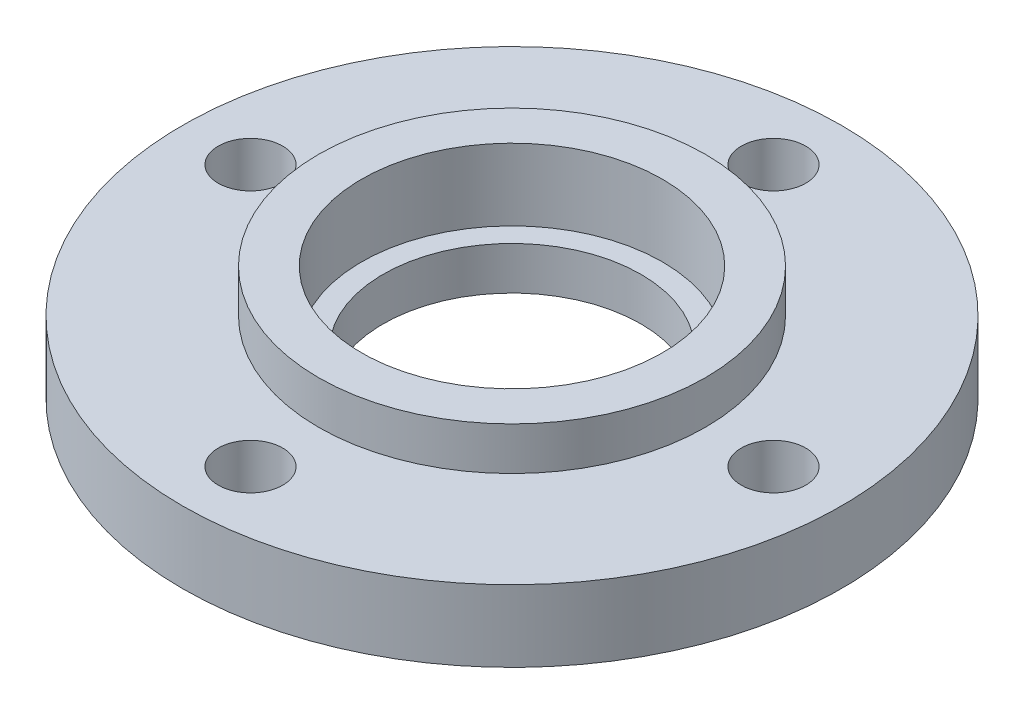
ISO-10303-21;
HEADER;
FILE_DESCRIPTION(('STEP AP214'),'2;1');
FILE_NAME('part.step','',(''),(''),'','','');
FILE_SCHEMA(('AUTOMOTIVE_DESIGN { 1 0 10303 214 1 1 1 1 }'));
ENDSEC;
DATA;
#1=APPLICATION_CONTEXT('core data for automotive mechanical design processes');
#2=APPLICATION_PROTOCOL_DEFINITION('international standard','automotive_design',2000,#1);
#3=PRODUCT_CONTEXT('',#1,'mechanical');
#4=PRODUCT('Part','Part','',(#3));
#5=PRODUCT_RELATED_PRODUCT_CATEGORY('part','',(#4));
#6=PRODUCT_DEFINITION_FORMATION('','',#4);
#7=PRODUCT_DEFINITION_CONTEXT('part definition',#1,'design');
#8=PRODUCT_DEFINITION('design','',#6,#7);
#9=PRODUCT_DEFINITION_SHAPE('','',#8);
#10=(LENGTH_UNIT() NAMED_UNIT(*) SI_UNIT(.MILLI.,.METRE.));
#11=(NAMED_UNIT(*) PLANE_ANGLE_UNIT() SI_UNIT($,.RADIAN.));
#12=(NAMED_UNIT(*) SI_UNIT($,.STERADIAN.) SOLID_ANGLE_UNIT());
#13=UNCERTAINTY_MEASURE_WITH_UNIT(LENGTH_MEASURE(1.E-05),#10,'distance_accuracy_value','');
#14=(GEOMETRIC_REPRESENTATION_CONTEXT(3) GLOBAL_UNCERTAINTY_ASSIGNED_CONTEXT((#13)) GLOBAL_UNIT_ASSIGNED_CONTEXT((#10,
#11,#12)) REPRESENTATION_CONTEXT('',''));
#15=CARTESIAN_POINT('',(0.,0.,0.));
#16=DIRECTION('',(0.,0.,1.));
#17=DIRECTION('',(1.,0.,0.));
#18=AXIS2_PLACEMENT_3D('',#15,#16,#17);
#19=CARTESIAN_POINT('',(10.5,0.,0.));
#20=DIRECTION('',(0.,1.,0.));
#21=DIRECTION('',(0.,0.,1.));
#22=AXIS2_PLACEMENT_3D('',#19,#20,#21);
#23=PLANE('',#22);
#24=CARTESIAN_POINT('',(0.,0.,0.));
#25=DIRECTION('',(0.,-1.,0.));
#26=DIRECTION('',(0.,0.,-1.));
#27=AXIS2_PLACEMENT_3D('',#24,#25,#26);
#28=CIRCLE('',#27,9.);
#29=CARTESIAN_POINT('',(0.,0.,-9.00000000000001));
#30=VERTEX_POINT('',#29);
#31=EDGE_CURVE('E10',#30,#30,#28,.T.);
#32=ORIENTED_EDGE('',*,*,#31,.T.);
#33=EDGE_LOOP('',(#32));
#34=FACE_BOUND('',#33,.T.);
#35=CARTESIAN_POINT('',(0.,0.,0.));
#36=DIRECTION('',(0.,-1.,0.));
#37=DIRECTION('',(0.,0.,-1.));
#38=AXIS2_PLACEMENT_3D('',#35,#36,#37);
#39=CIRCLE('',#38,10.5);
#40=CARTESIAN_POINT('',(0.,0.,-10.5));
#41=VERTEX_POINT('',#40);
#42=EDGE_CURVE('E60',#41,#41,#39,.T.);
#43=ORIENTED_EDGE('',*,*,#42,.F.);
#44=EDGE_LOOP('',(#43));
#45=FACE_BOUND('',#44,.T.);
#46=ADVANCED_FACE('F32',(#34,#45),#23,.T.);
#47=CARTESIAN_POINT('',(0.,-55.,0.));
#48=DIRECTION('',(0.,-1.,0.));
#49=DIRECTION('',(0.,0.,-1.));
#50=AXIS2_PLACEMENT_3D('',#47,#48,#49);
#51=CYLINDRICAL_SURFACE('',#50,9.);
#52=CARTESIAN_POINT('',(0.,-3.,0.));
#53=DIRECTION('',(0.,-1.,0.));
#54=DIRECTION('',(0.,0.,-1.));
#55=AXIS2_PLACEMENT_3D('',#52,#53,#54);
#56=CIRCLE('',#55,9.);
#57=CARTESIAN_POINT('',(0.,-3.,-9.00000000000001));
#58=VERTEX_POINT('',#57);
#59=EDGE_CURVE('E38',#58,#58,#56,.T.);
#60=ORIENTED_EDGE('',*,*,#59,.T.);
#61=EDGE_LOOP('',(#60));
#62=FACE_BOUND('',#61,.T.);
#63=ORIENTED_EDGE('',*,*,#31,.F.);
#64=EDGE_LOOP('',(#63));
#65=FACE_BOUND('',#64,.T.);
#66=ADVANCED_FACE('F114',(#62,#65),#51,.F.);
#67=CARTESIAN_POINT('',(9.00000000000001,-3.,0.));
#68=DIRECTION('',(0.,-1.,0.));
#69=DIRECTION('',(0.,0.,-1.));
#70=AXIS2_PLACEMENT_3D('',#67,#68,#69);
#71=PLANE('',#70);
#72=CARTESIAN_POINT('',(2.35922392732846E-13,-3.,18.25));
#73=DIRECTION('',(0.,1.,0.));
#74=DIRECTION('',(0.,0.,1.));
#75=AXIS2_PLACEMENT_3D('',#72,#73,#74);
#76=CIRCLE('',#75,2.25);
#77=CARTESIAN_POINT('',(2.37046493545279E-13,-3.,20.5));
#78=VERTEX_POINT('',#77);
#79=EDGE_CURVE('E81',#78,#78,#76,.T.);
#80=ORIENTED_EDGE('',*,*,#79,.T.);
#81=EDGE_LOOP('',(#80));
#82=FACE_BOUND('',#81,.T.);
#83=CARTESIAN_POINT('',(-18.25,-3.,0.));
#84=DIRECTION('',(0.,1.,0.));
#85=DIRECTION('',(0.,0.,1.));
#86=AXIS2_PLACEMENT_3D('',#83,#84,#85);
#87=CIRCLE('',#86,2.25);
#88=CARTESIAN_POINT('',(-18.25,-3.,2.25));
#89=VERTEX_POINT('',#88);
#90=EDGE_CURVE('E75',#89,#89,#87,.T.);
#91=ORIENTED_EDGE('',*,*,#90,.T.);
#92=EDGE_LOOP('',(#91));
#93=FACE_BOUND('',#92,.T.);
#94=CARTESIAN_POINT('',(0.,-3.,-18.25));
#95=DIRECTION('',(0.,1.,0.));
#96=DIRECTION('',(0.,0.,1.));
#97=AXIS2_PLACEMENT_3D('',#94,#95,#96);
#98=CIRCLE('',#97,2.25);
#99=CARTESIAN_POINT('',(0.,-3.,-16.));
#100=VERTEX_POINT('',#99);
#101=EDGE_CURVE('E69',#100,#100,#98,.T.);
#102=ORIENTED_EDGE('',*,*,#101,.T.);
#103=EDGE_LOOP('',(#102));
#104=FACE_BOUND('',#103,.T.);
#105=CARTESIAN_POINT('',(18.25,-3.,0.));
#106=DIRECTION('',(0.,1.,0.));
#107=DIRECTION('',(0.,0.,1.));
#108=AXIS2_PLACEMENT_3D('',#105,#106,#107);
#109=CIRCLE('',#108,2.25);
#110=CARTESIAN_POINT('',(18.25,-3.,2.25000000000004));
#111=VERTEX_POINT('',#110);
#112=EDGE_CURVE('E63',#111,#111,#109,.T.);
#113=ORIENTED_EDGE('',*,*,#112,.T.);
#114=EDGE_LOOP('',(#113));
#115=FACE_BOUND('',#114,.T.);
#116=CARTESIAN_POINT('',(0.,-3.,0.));
#117=DIRECTION('',(0.,-1.,0.));
#118=DIRECTION('',(0.,0.,-1.));
#119=AXIS2_PLACEMENT_3D('',#116,#117,#118);
#120=CIRCLE('',#119,23.);
#121=CARTESIAN_POINT('',(0.,-3.,-23.));
#122=VERTEX_POINT('',#121);
#123=EDGE_CURVE('E42',#122,#122,#120,.T.);
#124=ORIENTED_EDGE('',*,*,#123,.T.);
#125=EDGE_LOOP('',(#124));
#126=FACE_BOUND('',#125,.T.);
#127=ORIENTED_EDGE('',*,*,#59,.F.);
#128=EDGE_LOOP('',(#127));
#129=FACE_BOUND('',#128,.T.);
#130=ADVANCED_FACE('F108',(#82,#93,#104,#115,#126,#129),#71,.T.);
#131=CARTESIAN_POINT('',(0.,-55.,0.));
#132=DIRECTION('',(0.,-1.,0.));
#133=DIRECTION('',(0.,0.,-1.));
#134=AXIS2_PLACEMENT_3D('',#131,#132,#133);
#135=CYLINDRICAL_SURFACE('',#134,23.);
#136=CARTESIAN_POINT('',(0.,2.,0.));
#137=DIRECTION('',(0.,-1.,0.));
#138=DIRECTION('',(0.,0.,-1.));
#139=AXIS2_PLACEMENT_3D('',#136,#137,#138);
#140=CIRCLE('',#139,23.);
#141=CARTESIAN_POINT('',(0.,2.,-23.));
#142=VERTEX_POINT('',#141);
#143=EDGE_CURVE('E46',#142,#142,#140,.T.);
#144=ORIENTED_EDGE('',*,*,#143,.T.);
#145=EDGE_LOOP('',(#144));
#146=FACE_BOUND('',#145,.T.);
#147=ORIENTED_EDGE('',*,*,#123,.F.);
#148=EDGE_LOOP('',(#147));
#149=FACE_BOUND('',#148,.T.);
#150=ADVANCED_FACE('F94',(#146,#149),#135,.T.);
#151=CARTESIAN_POINT('',(23.,2.,0.));
#152=DIRECTION('',(0.,1.,0.));
#153=DIRECTION('',(0.,0.,1.));
#154=AXIS2_PLACEMENT_3D('',#151,#152,#153);
#155=PLANE('',#154);
#156=CARTESIAN_POINT('',(2.35922392732846E-13,2.,18.25));
#157=DIRECTION('',(0.,1.,0.));
#158=DIRECTION('',(0.,0.,1.));
#159=AXIS2_PLACEMENT_3D('',#156,#157,#158);
#160=CIRCLE('',#159,2.25);
#161=CARTESIAN_POINT('',(2.37046493545279E-13,2.,20.5));
#162=VERTEX_POINT('',#161);
#163=EDGE_CURVE('E84',#162,#162,#160,.T.);
#164=ORIENTED_EDGE('',*,*,#163,.F.);
#165=EDGE_LOOP('',(#164));
#166=FACE_BOUND('',#165,.T.);
#167=CARTESIAN_POINT('',(-18.25,2.,0.));
#168=DIRECTION('',(0.,1.,0.));
#169=DIRECTION('',(0.,0.,1.));
#170=AXIS2_PLACEMENT_3D('',#167,#168,#169);
#171=CIRCLE('',#170,2.25);
#172=CARTESIAN_POINT('',(-18.25,2.,2.25));
#173=VERTEX_POINT('',#172);
#174=EDGE_CURVE('E78',#173,#173,#171,.T.);
#175=ORIENTED_EDGE('',*,*,#174,.F.);
#176=EDGE_LOOP('',(#175));
#177=FACE_BOUND('',#176,.T.);
#178=CARTESIAN_POINT('',(0.,2.,-18.25));
#179=DIRECTION('',(0.,1.,0.));
#180=DIRECTION('',(0.,0.,1.));
#181=AXIS2_PLACEMENT_3D('',#178,#179,#180);
#182=CIRCLE('',#181,2.25);
#183=CARTESIAN_POINT('',(0.,2.,-16.));
#184=VERTEX_POINT('',#183);
#185=EDGE_CURVE('E72',#184,#184,#182,.T.);
#186=ORIENTED_EDGE('',*,*,#185,.F.);
#187=EDGE_LOOP('',(#186));
#188=FACE_BOUND('',#187,.T.);
#189=CARTESIAN_POINT('',(18.25,2.,0.));
#190=DIRECTION('',(0.,1.,0.));
#191=DIRECTION('',(0.,0.,1.));
#192=AXIS2_PLACEMENT_3D('',#189,#190,#191);
#193=CIRCLE('',#192,2.25);
#194=CARTESIAN_POINT('',(18.25,2.,2.25000000000004));
#195=VERTEX_POINT('',#194);
#196=EDGE_CURVE('E66',#195,#195,#193,.T.);
#197=ORIENTED_EDGE('',*,*,#196,.F.);
#198=EDGE_LOOP('',(#197));
#199=FACE_BOUND('',#198,.T.);
#200=CARTESIAN_POINT('',(0.,2.,0.));
#201=DIRECTION('',(0.,-1.,0.));
#202=DIRECTION('',(0.,0.,-1.));
#203=AXIS2_PLACEMENT_3D('',#200,#201,#202);
#204=CIRCLE('',#203,13.5);
#205=CARTESIAN_POINT('',(0.,2.,-13.5));
#206=VERTEX_POINT('',#205);
#207=EDGE_CURVE('E51',#206,#206,#204,.T.);
#208=ORIENTED_EDGE('',*,*,#207,.T.);
#209=EDGE_LOOP('',(#208));
#210=FACE_BOUND('',#209,.T.);
#211=ORIENTED_EDGE('',*,*,#143,.F.);
#212=EDGE_LOOP('',(#211));
#213=FACE_BOUND('',#212,.T.);
#214=ADVANCED_FACE('F90',(#166,#177,#188,#199,#210,#213),#155,.T.);
#215=CARTESIAN_POINT('',(0.,-55.,0.));
#216=DIRECTION('',(0.,-1.,0.));
#217=DIRECTION('',(0.,0.,-1.));
#218=AXIS2_PLACEMENT_3D('',#215,#216,#217);
#219=CYLINDRICAL_SURFACE('',#218,13.5);
#220=CARTESIAN_POINT('',(0.,5.,0.));
#221=DIRECTION('',(0.,-1.,0.));
#222=DIRECTION('',(0.,0.,-1.));
#223=AXIS2_PLACEMENT_3D('',#220,#221,#222);
#224=CIRCLE('',#223,13.5);
#225=CARTESIAN_POINT('',(0.,5.,-13.5));
#226=VERTEX_POINT('',#225);
#227=EDGE_CURVE('E54',#226,#226,#224,.T.);
#228=ORIENTED_EDGE('',*,*,#227,.T.);
#229=EDGE_LOOP('',(#228));
#230=FACE_BOUND('',#229,.T.);
#231=ORIENTED_EDGE('',*,*,#207,.F.);
#232=EDGE_LOOP('',(#231));
#233=FACE_BOUND('',#232,.T.);
#234=ADVANCED_FACE('F93',(#230,#233),#219,.T.);
#235=CARTESIAN_POINT('',(13.5,5.,0.));
#236=DIRECTION('',(0.,1.,0.));
#237=DIRECTION('',(0.,0.,1.));
#238=AXIS2_PLACEMENT_3D('',#235,#236,#237);
#239=PLANE('',#238);
#240=CARTESIAN_POINT('',(0.,5.,0.));
#241=DIRECTION('',(0.,-1.,0.));
#242=DIRECTION('',(0.,0.,-1.));
#243=AXIS2_PLACEMENT_3D('',#240,#241,#242);
#244=CIRCLE('',#243,10.5);
#245=CARTESIAN_POINT('',(0.,5.,-10.5));
#246=VERTEX_POINT('',#245);
#247=EDGE_CURVE('E57',#246,#246,#244,.T.);
#248=ORIENTED_EDGE('',*,*,#247,.T.);
#249=EDGE_LOOP('',(#248));
#250=FACE_BOUND('',#249,.T.);
#251=ORIENTED_EDGE('',*,*,#227,.F.);
#252=EDGE_LOOP('',(#251));
#253=FACE_BOUND('',#252,.T.);
#254=ADVANCED_FACE('F131',(#250,#253),#239,.T.);
#255=CARTESIAN_POINT('',(0.,-55.,0.));
#256=DIRECTION('',(0.,-1.,0.));
#257=DIRECTION('',(0.,0.,-1.));
#258=AXIS2_PLACEMENT_3D('',#255,#256,#257);
#259=CYLINDRICAL_SURFACE('',#258,10.5);
#260=ORIENTED_EDGE('',*,*,#42,.T.);
#261=EDGE_LOOP('',(#260));
#262=FACE_BOUND('',#261,.T.);
#263=ORIENTED_EDGE('',*,*,#247,.F.);
#264=EDGE_LOOP('',(#263));
#265=FACE_BOUND('',#264,.T.);
#266=ADVANCED_FACE('F127',(#262,#265),#259,.F.);
#267=CARTESIAN_POINT('',(18.25,2.,0.));
#268=DIRECTION('',(0.,1.,0.));
#269=DIRECTION('',(0.,0.,1.));
#270=AXIS2_PLACEMENT_3D('',#267,#268,#269);
#271=CYLINDRICAL_SURFACE('',#270,2.25);
#272=ORIENTED_EDGE('',*,*,#112,.F.);
#273=EDGE_LOOP('',(#272));
#274=FACE_BOUND('',#273,.T.);
#275=ORIENTED_EDGE('',*,*,#196,.T.);
#276=EDGE_LOOP('',(#275));
#277=FACE_BOUND('',#276,.T.);
#278=ADVANCED_FACE('F130',(#274,#277),#271,.F.);
#279=CARTESIAN_POINT('',(0.,2.,-18.25));
#280=DIRECTION('',(0.,1.,0.));
#281=DIRECTION('',(0.,0.,1.));
#282=AXIS2_PLACEMENT_3D('',#279,#280,#281);
#283=CYLINDRICAL_SURFACE('',#282,2.25);
#284=ORIENTED_EDGE('',*,*,#101,.F.);
#285=EDGE_LOOP('',(#284));
#286=FACE_BOUND('',#285,.T.);
#287=ORIENTED_EDGE('',*,*,#185,.T.);
#288=EDGE_LOOP('',(#287));
#289=FACE_BOUND('',#288,.T.);
#290=ADVANCED_FACE('F148',(#286,#289),#283,.F.);
#291=CARTESIAN_POINT('',(-18.25,2.,0.));
#292=DIRECTION('',(0.,1.,0.));
#293=DIRECTION('',(0.,0.,1.));
#294=AXIS2_PLACEMENT_3D('',#291,#292,#293);
#295=CYLINDRICAL_SURFACE('',#294,2.25);
#296=ORIENTED_EDGE('',*,*,#90,.F.);
#297=EDGE_LOOP('',(#296));
#298=FACE_BOUND('',#297,.T.);
#299=ORIENTED_EDGE('',*,*,#174,.T.);
#300=EDGE_LOOP('',(#299));
#301=FACE_BOUND('',#300,.T.);
#302=ADVANCED_FACE('F152',(#298,#301),#295,.F.);
#303=CARTESIAN_POINT('',(2.35922392732846E-13,2.,18.25));
#304=DIRECTION('',(0.,1.,0.));
#305=DIRECTION('',(0.,0.,1.));
#306=AXIS2_PLACEMENT_3D('',#303,#304,#305);
#307=CYLINDRICAL_SURFACE('',#306,2.25);
#308=ORIENTED_EDGE('',*,*,#79,.F.);
#309=EDGE_LOOP('',(#308));
#310=FACE_BOUND('',#309,.T.);
#311=ORIENTED_EDGE('',*,*,#163,.T.);
#312=EDGE_LOOP('',(#311));
#313=FACE_BOUND('',#312,.T.);
#314=ADVANCED_FACE('F88',(#310,#313),#307,.F.);
#315=CLOSED_SHELL('',(#46,#66,#130,#150,#214,#234,#254,#266,#278,#290,#302,#314));
#316=MANIFOLD_SOLID_BREP('B2',#315);
#317=ADVANCED_BREP_SHAPE_REPRESENTATION('',(#18,#316),#14);
#318=SHAPE_DEFINITION_REPRESENTATION(#9,#317);
ENDSEC;
END-ISO-10303-21;
